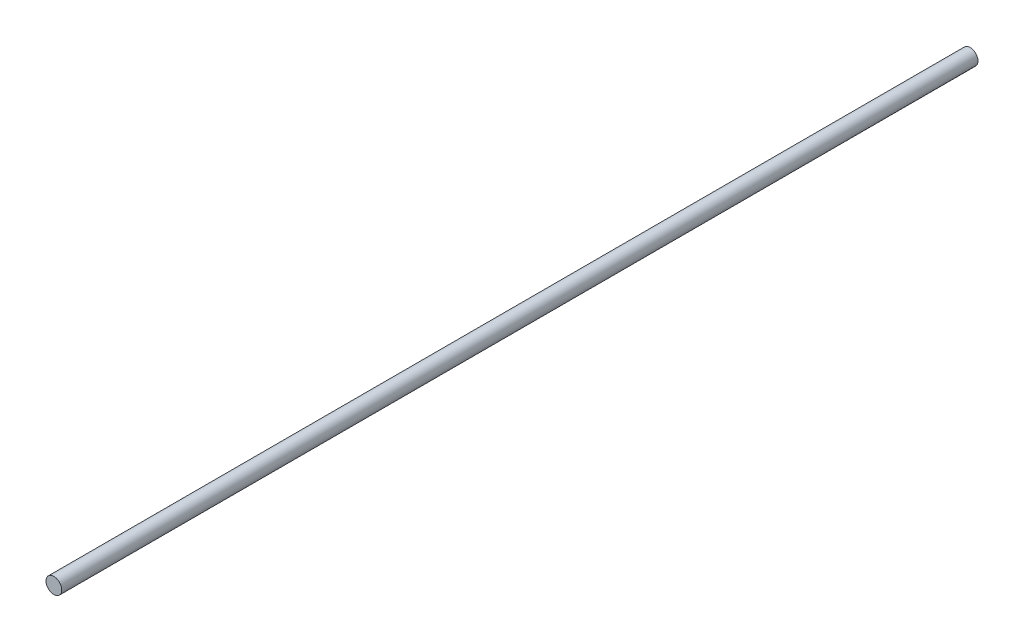
ISO-10303-21;
HEADER;
FILE_DESCRIPTION(('STEP AP214'),'2;1');
FILE_NAME('part.step','',(''),(''),'','','');
FILE_SCHEMA(('AUTOMOTIVE_DESIGN { 1 0 10303 214 1 1 1 1 }'));
ENDSEC;
DATA;
#1=APPLICATION_CONTEXT('core data for automotive mechanical design processes');
#2=APPLICATION_PROTOCOL_DEFINITION('international standard','automotive_design',2000,#1);
#3=PRODUCT_CONTEXT('',#1,'mechanical');
#4=PRODUCT('Part','Part','',(#3));
#5=PRODUCT_RELATED_PRODUCT_CATEGORY('part','',(#4));
#6=PRODUCT_DEFINITION_FORMATION('','',#4);
#7=PRODUCT_DEFINITION_CONTEXT('part definition',#1,'design');
#8=PRODUCT_DEFINITION('design','',#6,#7);
#9=PRODUCT_DEFINITION_SHAPE('','',#8);
#10=(LENGTH_UNIT() NAMED_UNIT(*) SI_UNIT(.MILLI.,.METRE.));
#11=(NAMED_UNIT(*) PLANE_ANGLE_UNIT() SI_UNIT($,.RADIAN.));
#12=(NAMED_UNIT(*) SI_UNIT($,.STERADIAN.) SOLID_ANGLE_UNIT());
#13=UNCERTAINTY_MEASURE_WITH_UNIT(LENGTH_MEASURE(1.E-05),#10,'distance_accuracy_value','');
#14=(GEOMETRIC_REPRESENTATION_CONTEXT(3) GLOBAL_UNCERTAINTY_ASSIGNED_CONTEXT((#13)) GLOBAL_UNIT_ASSIGNED_CONTEXT((#10,
#11,#12)) REPRESENTATION_CONTEXT('',''));
#15=CARTESIAN_POINT('',(0.,0.,0.));
#16=DIRECTION('',(0.,0.,1.));
#17=DIRECTION('',(1.,0.,0.));
#18=AXIS2_PLACEMENT_3D('',#15,#16,#17);
#19=CARTESIAN_POINT('',(0.,0.,349.4));
#20=DIRECTION('',(0.,0.,-1.));
#21=DIRECTION('',(-1.,0.,0.));
#22=AXIS2_PLACEMENT_3D('',#19,#20,#21);
#23=CYLINDRICAL_SURFACE('',#22,3.);
#24=CARTESIAN_POINT('',(0.,0.,349.4));
#25=DIRECTION('',(0.,0.,1.));
#26=DIRECTION('',(1.,0.,0.));
#27=AXIS2_PLACEMENT_3D('',#24,#25,#26);
#28=CIRCLE('',#27,3.);
#29=CARTESIAN_POINT('',(3.,0.,349.4));
#30=VERTEX_POINT('',#29);
#31=EDGE_CURVE('E10',#30,#30,#28,.T.);
#32=ORIENTED_EDGE('',*,*,#31,.F.);
#33=EDGE_LOOP('',(#32));
#34=FACE_BOUND('',#33,.T.);
#35=CARTESIAN_POINT('',(0.,0.,0.));
#36=DIRECTION('',(0.,0.,1.));
#37=DIRECTION('',(1.,0.,0.));
#38=AXIS2_PLACEMENT_3D('',#35,#36,#37);
#39=CIRCLE('',#38,3.);
#40=CARTESIAN_POINT('',(3.,0.,0.));
#41=VERTEX_POINT('',#40);
#42=EDGE_CURVE('E40',#41,#41,#39,.T.);
#43=ORIENTED_EDGE('',*,*,#42,.T.);
#44=EDGE_LOOP('',(#43));
#45=FACE_BOUND('',#44,.T.);
#46=ADVANCED_FACE('F37',(#34,#45),#23,.T.);
#47=CARTESIAN_POINT('',(0.,0.,349.4));
#48=DIRECTION('',(0.,0.,1.));
#49=DIRECTION('',(1.,0.,0.));
#50=AXIS2_PLACEMENT_3D('',#47,#48,#49);
#51=PLANE('',#50);
#52=ORIENTED_EDGE('',*,*,#31,.T.);
#53=EDGE_LOOP('',(#52));
#54=FACE_BOUND('',#53,.T.);
#55=ADVANCED_FACE('F52',(#54),#51,.T.);
#56=CARTESIAN_POINT('',(0.,0.,0.));
#57=DIRECTION('',(0.,0.,1.));
#58=DIRECTION('',(1.,0.,0.));
#59=AXIS2_PLACEMENT_3D('',#56,#57,#58);
#60=PLANE('',#59);
#61=ORIENTED_EDGE('',*,*,#42,.F.);
#62=EDGE_LOOP('',(#61));
#63=FACE_BOUND('',#62,.T.);
#64=ADVANCED_FACE('F50',(#63),#60,.F.);
#65=CLOSED_SHELL('',(#46,#55,#64));
#66=MANIFOLD_SOLID_BREP('B2',#65);
#67=ADVANCED_BREP_SHAPE_REPRESENTATION('',(#18,#66),#14);
#68=SHAPE_DEFINITION_REPRESENTATION(#9,#67);
ENDSEC;
END-ISO-10303-21;
